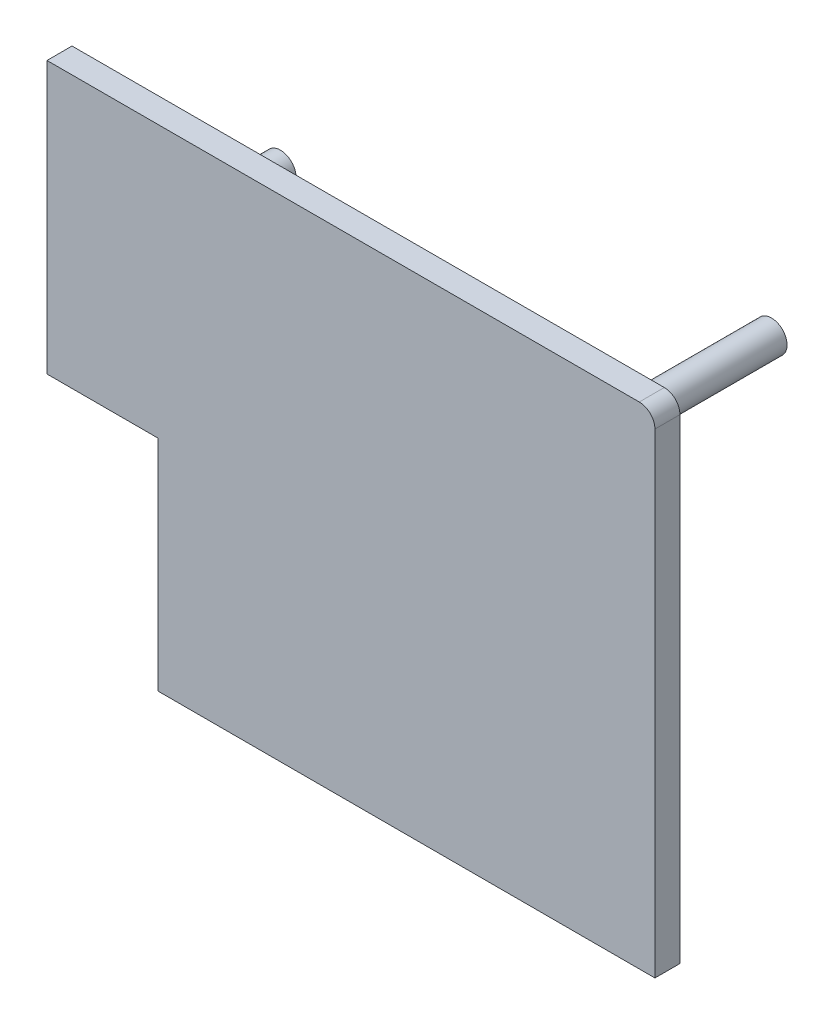
ISO-10303-21;
HEADER;
FILE_DESCRIPTION(('STEP AP214'),'2;1');
FILE_NAME('part.step','',(''),(''),'','','');
FILE_SCHEMA(('AUTOMOTIVE_DESIGN { 1 0 10303 214 1 1 1 1 }'));
ENDSEC;
DATA;
#1=APPLICATION_CONTEXT('core data for automotive mechanical design processes');
#2=APPLICATION_PROTOCOL_DEFINITION('international standard','automotive_design',2000,#1);
#3=PRODUCT_CONTEXT('',#1,'mechanical');
#4=PRODUCT('Part','Part','',(#3));
#5=PRODUCT_RELATED_PRODUCT_CATEGORY('part','',(#4));
#6=PRODUCT_DEFINITION_FORMATION('','',#4);
#7=PRODUCT_DEFINITION_CONTEXT('part definition',#1,'design');
#8=PRODUCT_DEFINITION('design','',#6,#7);
#9=PRODUCT_DEFINITION_SHAPE('','',#8);
#10=(LENGTH_UNIT() NAMED_UNIT(*) SI_UNIT(.MILLI.,.METRE.));
#11=(NAMED_UNIT(*) PLANE_ANGLE_UNIT() SI_UNIT($,.RADIAN.));
#12=(NAMED_UNIT(*) SI_UNIT($,.STERADIAN.) SOLID_ANGLE_UNIT());
#13=UNCERTAINTY_MEASURE_WITH_UNIT(LENGTH_MEASURE(1.E-05),#10,'distance_accuracy_value','');
#14=(GEOMETRIC_REPRESENTATION_CONTEXT(3) GLOBAL_UNCERTAINTY_ASSIGNED_CONTEXT((#13)) GLOBAL_UNIT_ASSIGNED_CONTEXT((#10,
#11,#12)) REPRESENTATION_CONTEXT('',''));
#15=CARTESIAN_POINT('',(0.,0.,0.));
#16=DIRECTION('',(0.,0.,1.));
#17=DIRECTION('',(1.,0.,0.));
#18=AXIS2_PLACEMENT_3D('',#15,#16,#17);
#19=CARTESIAN_POINT('',(214.083314685516,-91.4262053852729,1.6));
#20=DIRECTION('',(0.000641231266330713,-0.999999794411211,0.));
#21=DIRECTION('',(0.99999979441121,0.000641231266330713,0.));
#22=AXIS2_PLACEMENT_3D('',#19,#20,#21);
#23=PLANE('',#22);
#24=DIRECTION('',(-0.99999979441121,-0.000641231266330713,0.));
#25=VECTOR('',#24,1.);
#26=CARTESIAN_POINT('',(214.083314685516,-91.4262053852729,0.));
#27=LINE('',#26,#25);
#28=CARTESIAN_POINT('',(251.949358862533,-91.4019244888224,0.));
#29=VERTEX_POINT('',#28);
#30=CARTESIAN_POINT('',(214.083314685516,-91.4262053852729,0.));
#31=VERTEX_POINT('',#30);
#32=EDGE_CURVE('E130',#29,#31,#27,.T.);
#33=ORIENTED_EDGE('',*,*,#32,.T.);
#34=DIRECTION('',(0.,0.,-1.));
#35=VECTOR('',#34,1.);
#36=CARTESIAN_POINT('',(214.083314685516,-91.4262053852729,1.6));
#37=LINE('',#36,#35);
#38=CARTESIAN_POINT('',(214.083314685516,-91.4262053852729,1.6));
#39=VERTEX_POINT('',#38);
#40=EDGE_CURVE('E11',#39,#31,#37,.T.);
#41=ORIENTED_EDGE('',*,*,#40,.F.);
#42=DIRECTION('',(-0.99999979441121,-0.000641231266330713,0.));
#43=VECTOR('',#42,1.);
#44=CARTESIAN_POINT('',(214.083314685516,-91.4262053852729,1.6));
#45=LINE('',#44,#43);
#46=CARTESIAN_POINT('',(251.949358862533,-91.4019244888224,1.6));
#47=VERTEX_POINT('',#46);
#48=EDGE_CURVE('E143',#47,#39,#45,.T.);
#49=ORIENTED_EDGE('',*,*,#48,.F.);
#50=DIRECTION('',(0.,0.,-1.));
#51=VECTOR('',#50,1.);
#52=CARTESIAN_POINT('',(251.949358862533,-91.4019244888224,1.6));
#53=LINE('',#52,#51);
#54=EDGE_CURVE('E126',#47,#29,#53,.T.);
#55=ORIENTED_EDGE('',*,*,#54,.T.);
#56=EDGE_LOOP('',(#33,#41,#49,#55));
#57=FACE_BOUND('',#56,.T.);
#58=ADVANCED_FACE('F40',(#57),#23,.F.);
#59=CARTESIAN_POINT('',(214.083314685516,-91.4262053852729,1.6));
#60=DIRECTION('',(1.,0.,0.));
#61=DIRECTION('',(0.,0.,-1.));
#62=AXIS2_PLACEMENT_3D('',#59,#60,#61);
#63=PLANE('',#62);
#64=DIRECTION('',(0.,-1.,0.));
#65=VECTOR('',#64,1.);
#66=CARTESIAN_POINT('',(214.083314685516,-91.4262053852729,0.));
#67=LINE('',#66,#65);
#68=CARTESIAN_POINT('',(214.083314685516,-108.787959340399,0.));
#69=VERTEX_POINT('',#68);
#70=EDGE_CURVE('E133',#31,#69,#67,.T.);
#71=ORIENTED_EDGE('',*,*,#70,.T.);
#72=DIRECTION('',(0.,0.,-1.));
#73=VECTOR('',#72,1.);
#74=CARTESIAN_POINT('',(214.083314685516,-108.787959340399,1.6));
#75=LINE('',#74,#73);
#76=CARTESIAN_POINT('',(214.083314685516,-108.787959340399,1.6));
#77=VERTEX_POINT('',#76);
#78=EDGE_CURVE('E48',#77,#69,#75,.T.);
#79=ORIENTED_EDGE('',*,*,#78,.F.);
#80=DIRECTION('',(0.,-1.,0.));
#81=VECTOR('',#80,1.);
#82=CARTESIAN_POINT('',(214.083314685516,-91.4262053852729,1.6));
#83=LINE('',#82,#81);
#84=EDGE_CURVE('E96',#39,#77,#83,.T.);
#85=ORIENTED_EDGE('',*,*,#84,.F.);
#86=ORIENTED_EDGE('',*,*,#40,.T.);
#87=EDGE_LOOP('',(#71,#79,#85,#86));
#88=FACE_BOUND('',#87,.T.);
#89=ADVANCED_FACE('F211',(#88),#63,.F.);
#90=CARTESIAN_POINT('',(214.083314685516,-108.787959340399,1.6));
#91=DIRECTION('',(0.,1.,0.));
#92=DIRECTION('',(0.,0.,1.));
#93=AXIS2_PLACEMENT_3D('',#90,#91,#92);
#94=PLANE('',#93);
#95=DIRECTION('',(1.,0.,0.));
#96=VECTOR('',#95,1.);
#97=CARTESIAN_POINT('',(214.083314685516,-108.787959340399,0.));
#98=LINE('',#97,#96);
#99=CARTESIAN_POINT('',(221.166748687381,-108.787959340399,0.));
#100=VERTEX_POINT('',#99);
#101=EDGE_CURVE('E136',#69,#100,#98,.T.);
#102=ORIENTED_EDGE('',*,*,#101,.T.);
#103=DIRECTION('',(0.,0.,-1.));
#104=VECTOR('',#103,1.);
#105=CARTESIAN_POINT('',(221.166748687381,-108.787959340399,1.6));
#106=LINE('',#105,#104);
#107=CARTESIAN_POINT('',(221.166748687381,-108.787959340399,1.6));
#108=VERTEX_POINT('',#107);
#109=EDGE_CURVE('E147',#108,#100,#106,.T.);
#110=ORIENTED_EDGE('',*,*,#109,.F.);
#111=DIRECTION('',(1.,0.,0.));
#112=VECTOR('',#111,1.);
#113=CARTESIAN_POINT('',(214.083314685516,-108.787959340399,1.6));
#114=LINE('',#113,#112);
#115=EDGE_CURVE('E155',#77,#108,#114,.T.);
#116=ORIENTED_EDGE('',*,*,#115,.F.);
#117=ORIENTED_EDGE('',*,*,#78,.T.);
#118=EDGE_LOOP('',(#102,#110,#116,#117));
#119=FACE_BOUND('',#118,.T.);
#120=ADVANCED_FACE('F153',(#119),#94,.F.);
#121=CARTESIAN_POINT('',(221.166748687381,-108.787959340399,1.6));
#122=DIRECTION('',(1.,0.,0.));
#123=DIRECTION('',(0.,0.,-1.));
#124=AXIS2_PLACEMENT_3D('',#121,#122,#123);
#125=PLANE('',#124);
#126=DIRECTION('',(0.,-1.,0.));
#127=VECTOR('',#126,1.);
#128=CARTESIAN_POINT('',(221.166748687381,-108.787959340399,0.));
#129=LINE('',#128,#127);
#130=CARTESIAN_POINT('',(221.166748687381,-122.793871773047,0.));
#131=VERTEX_POINT('',#130);
#132=EDGE_CURVE('E138',#100,#131,#129,.T.);
#133=ORIENTED_EDGE('',*,*,#132,.T.);
#134=DIRECTION('',(0.,0.,-1.));
#135=VECTOR('',#134,1.);
#136=CARTESIAN_POINT('',(221.166748687381,-122.793871773047,1.6));
#137=LINE('',#136,#135);
#138=CARTESIAN_POINT('',(221.166748687381,-122.793871773047,1.6));
#139=VERTEX_POINT('',#138);
#140=EDGE_CURVE('E121',#139,#131,#137,.T.);
#141=ORIENTED_EDGE('',*,*,#140,.F.);
#142=DIRECTION('',(0.,-1.,0.));
#143=VECTOR('',#142,1.);
#144=CARTESIAN_POINT('',(221.166748687381,-108.787959340399,1.6));
#145=LINE('',#144,#143);
#146=EDGE_CURVE('E112',#108,#139,#145,.T.);
#147=ORIENTED_EDGE('',*,*,#146,.F.);
#148=ORIENTED_EDGE('',*,*,#109,.T.);
#149=EDGE_LOOP('',(#133,#141,#147,#148));
#150=FACE_BOUND('',#149,.T.);
#151=ADVANCED_FACE('F161',(#150),#125,.F.);
#152=CARTESIAN_POINT('',(221.166748687381,-122.793871773047,1.6));
#153=DIRECTION('',(0.,1.,0.));
#154=DIRECTION('',(0.,0.,1.));
#155=AXIS2_PLACEMENT_3D('',#152,#153,#154);
#156=PLANE('',#155);
#157=DIRECTION('',(1.,0.,0.));
#158=VECTOR('',#157,1.);
#159=CARTESIAN_POINT('',(221.166748687381,-122.793871773047,0.));
#160=LINE('',#159,#158);
#161=CARTESIAN_POINT('',(252.95,-122.793871773047,0.));
#162=VERTEX_POINT('',#161);
#163=EDGE_CURVE('E120',#131,#162,#160,.T.);
#164=ORIENTED_EDGE('',*,*,#163,.T.);
#165=DIRECTION('',(0.,0.,-1.));
#166=VECTOR('',#165,1.);
#167=CARTESIAN_POINT('',(252.95,-122.793871773047,1.6));
#168=LINE('',#167,#166);
#169=CARTESIAN_POINT('',(252.95,-122.793871773047,1.6));
#170=VERTEX_POINT('',#169);
#171=EDGE_CURVE('E117',#170,#162,#168,.T.);
#172=ORIENTED_EDGE('',*,*,#171,.F.);
#173=DIRECTION('',(1.,0.,0.));
#174=VECTOR('',#173,1.);
#175=CARTESIAN_POINT('',(221.166748687381,-122.793871773047,1.6));
#176=LINE('',#175,#174);
#177=EDGE_CURVE('E106',#139,#170,#176,.T.);
#178=ORIENTED_EDGE('',*,*,#177,.F.);
#179=ORIENTED_EDGE('',*,*,#140,.T.);
#180=EDGE_LOOP('',(#164,#172,#178,#179));
#181=FACE_BOUND('',#180,.T.);
#182=ADVANCED_FACE('F118',(#181),#156,.F.);
#183=CARTESIAN_POINT('',(252.95,-92.4019243,1.6));
#184=DIRECTION('',(-1.,0.,0.));
#185=DIRECTION('',(0.,0.,1.));
#186=AXIS2_PLACEMENT_3D('',#183,#184,#185);
#187=PLANE('',#186);
#188=DIRECTION('',(0.,1.,0.));
#189=VECTOR('',#188,1.);
#190=CARTESIAN_POINT('',(252.95,-92.4019243,0.));
#191=LINE('',#190,#189);
#192=CARTESIAN_POINT('',(252.95,-92.4019243,0.));
#193=VERTEX_POINT('',#192);
#194=EDGE_CURVE('E82',#162,#193,#191,.T.);
#195=ORIENTED_EDGE('',*,*,#194,.T.);
#196=DIRECTION('',(0.,0.,-1.));
#197=VECTOR('',#196,1.);
#198=CARTESIAN_POINT('',(252.95,-92.4019243,1.6));
#199=LINE('',#198,#197);
#200=CARTESIAN_POINT('',(252.95,-92.4019243,1.6));
#201=VERTEX_POINT('',#200);
#202=EDGE_CURVE('E122',#201,#193,#199,.T.);
#203=ORIENTED_EDGE('',*,*,#202,.F.);
#204=DIRECTION('',(0.,1.,0.));
#205=VECTOR('',#204,1.);
#206=CARTESIAN_POINT('',(252.95,-92.4019243,1.6));
#207=LINE('',#206,#205);
#208=EDGE_CURVE('E110',#170,#201,#207,.T.);
#209=ORIENTED_EDGE('',*,*,#208,.F.);
#210=ORIENTED_EDGE('',*,*,#171,.T.);
#211=EDGE_LOOP('',(#195,#203,#209,#210));
#212=FACE_BOUND('',#211,.T.);
#213=ADVANCED_FACE('F124',(#212),#187,.F.);
#214=CARTESIAN_POINT('',(251.950000093739,-92.4019241894947,1.6));
#215=DIRECTION('',(0.,0.,-1.));
#216=DIRECTION('',(-1.,0.,0.));
#217=AXIS2_PLACEMENT_3D('',#214,#215,#216);
#218=CYLINDRICAL_SURFACE('',#217,0.999999906261072);
#219=CARTESIAN_POINT('',(251.950000093739,-92.4019241894947,0.));
#220=DIRECTION('',(0.,0.,1.));
#221=DIRECTION('',(-1.,0.,0.));
#222=AXIS2_PLACEMENT_3D('',#219,#220,#221);
#223=CIRCLE('',#222,0.999999906261072);
#224=EDGE_CURVE('E88',#193,#29,#223,.T.);
#225=ORIENTED_EDGE('',*,*,#224,.T.);
#226=ORIENTED_EDGE('',*,*,#54,.F.);
#227=CARTESIAN_POINT('',(251.950000093739,-92.4019241894947,1.6));
#228=DIRECTION('',(0.,0.,1.));
#229=DIRECTION('',(-1.,0.,0.));
#230=AXIS2_PLACEMENT_3D('',#227,#228,#229);
#231=CIRCLE('',#230,0.999999906261072);
#232=EDGE_CURVE('E56',#201,#47,#231,.T.);
#233=ORIENTED_EDGE('',*,*,#232,.F.);
#234=ORIENTED_EDGE('',*,*,#202,.T.);
#235=EDGE_LOOP('',(#225,#226,#233,#234));
#236=FACE_BOUND('',#235,.T.);
#237=ADVANCED_FACE('F218',(#236),#218,.T.);
#238=CARTESIAN_POINT('',(251.950000093739,-92.4019241894947,1.6));
#239=DIRECTION('',(0.,0.,-1.));
#240=DIRECTION('',(-1.,0.,0.));
#241=AXIS2_PLACEMENT_3D('',#238,#239,#240);
#242=PLANE('',#241);
#243=ORIENTED_EDGE('',*,*,#48,.T.);
#244=ORIENTED_EDGE('',*,*,#84,.T.);
#245=ORIENTED_EDGE('',*,*,#115,.T.);
#246=ORIENTED_EDGE('',*,*,#146,.T.);
#247=ORIENTED_EDGE('',*,*,#177,.T.);
#248=ORIENTED_EDGE('',*,*,#208,.T.);
#249=ORIENTED_EDGE('',*,*,#232,.T.);
#250=EDGE_LOOP('',(#243,#244,#245,#246,#247,#248,#249));
#251=FACE_BOUND('',#250,.T.);
#252=ADVANCED_FACE('F108',(#251),#242,.F.);
#253=CARTESIAN_POINT('',(251.950000093739,-92.4019241894947,0.));
#254=DIRECTION('',(0.,0.,-1.));
#255=DIRECTION('',(-1.,0.,0.));
#256=AXIS2_PLACEMENT_3D('',#253,#254,#255);
#257=PLANE('',#256);
#258=CARTESIAN_POINT('',(249.796682579057,-94.1240989966427,0.));
#259=DIRECTION('',(0.,0.,-1.));
#260=DIRECTION('',(-1.,0.,0.));
#261=AXIS2_PLACEMENT_3D('',#258,#259,#260);
#262=CIRCLE('',#261,0.999999999999998);
#263=CARTESIAN_POINT('',(248.796682579057,-94.1240989966427,0.));
#264=VERTEX_POINT('',#263);
#265=EDGE_CURVE('E175',#264,#264,#262,.T.);
#266=ORIENTED_EDGE('',*,*,#265,.F.);
#267=EDGE_LOOP('',(#266));
#268=FACE_BOUND('',#267,.T.);
#269=CARTESIAN_POINT('',(241.552042549363,-120.532057670433,0.));
#270=DIRECTION('',(0.,0.,-1.));
#271=DIRECTION('',(-1.,0.,0.));
#272=AXIS2_PLACEMENT_3D('',#269,#270,#271);
#273=CIRCLE('',#272,0.999999999999998);
#274=CARTESIAN_POINT('',(240.552042549363,-120.532057670433,0.));
#275=VERTEX_POINT('',#274);
#276=EDGE_CURVE('E181',#275,#275,#273,.T.);
#277=ORIENTED_EDGE('',*,*,#276,.F.);
#278=EDGE_LOOP('',(#277));
#279=FACE_BOUND('',#278,.T.);
#280=CARTESIAN_POINT('',(218.408459115756,-100.527296583156,0.));
#281=DIRECTION('',(0.,0.,-1.));
#282=DIRECTION('',(-1.,0.,0.));
#283=AXIS2_PLACEMENT_3D('',#280,#281,#282);
#284=CIRCLE('',#283,0.999999999999998);
#285=CARTESIAN_POINT('',(217.408459115756,-100.527296583156,0.));
#286=VERTEX_POINT('',#285);
#287=EDGE_CURVE('E169',#286,#286,#284,.T.);
#288=ORIENTED_EDGE('',*,*,#287,.F.);
#289=EDGE_LOOP('',(#288));
#290=FACE_BOUND('',#289,.T.);
#291=CARTESIAN_POINT('',(224.853507666887,-120.532057670433,0.));
#292=DIRECTION('',(0.,0.,-1.));
#293=DIRECTION('',(-1.,0.,0.));
#294=AXIS2_PLACEMENT_3D('',#291,#292,#293);
#295=CIRCLE('',#294,0.999999999999998);
#296=CARTESIAN_POINT('',(223.853507666887,-120.532057670433,0.));
#297=VERTEX_POINT('',#296);
#298=EDGE_CURVE('E166',#297,#297,#295,.T.);
#299=ORIENTED_EDGE('',*,*,#298,.F.);
#300=EDGE_LOOP('',(#299));
#301=FACE_BOUND('',#300,.T.);
#302=ORIENTED_EDGE('',*,*,#32,.F.);
#303=ORIENTED_EDGE('',*,*,#224,.F.);
#304=ORIENTED_EDGE('',*,*,#194,.F.);
#305=ORIENTED_EDGE('',*,*,#163,.F.);
#306=ORIENTED_EDGE('',*,*,#132,.F.);
#307=ORIENTED_EDGE('',*,*,#101,.F.);
#308=ORIENTED_EDGE('',*,*,#70,.F.);
#309=EDGE_LOOP('',(#302,#303,#304,#305,#306,#307,#308));
#310=FACE_BOUND('',#309,.T.);
#311=ADVANCED_FACE('F159',(#268,#279,#290,#301,#310),#257,.T.);
#312=CARTESIAN_POINT('',(224.853507666887,-120.532057670433,-9.));
#313=DIRECTION('',(0.,0.,1.));
#314=DIRECTION('',(1.,0.,0.));
#315=AXIS2_PLACEMENT_3D('',#312,#313,#314);
#316=CYLINDRICAL_SURFACE('',#315,0.999999999999998);
#317=CARTESIAN_POINT('',(224.853507666887,-120.532057670433,-9.));
#318=DIRECTION('',(0.,0.,-1.));
#319=DIRECTION('',(-1.,0.,0.));
#320=AXIS2_PLACEMENT_3D('',#317,#318,#319);
#321=CIRCLE('',#320,0.999999999999998);
#322=CARTESIAN_POINT('',(223.853507666887,-120.532057670433,-9.));
#323=VERTEX_POINT('',#322);
#324=EDGE_CURVE('E134',#323,#323,#321,.T.);
#325=ORIENTED_EDGE('',*,*,#324,.F.);
#326=EDGE_LOOP('',(#325));
#327=FACE_BOUND('',#326,.T.);
#328=ORIENTED_EDGE('',*,*,#298,.T.);
#329=EDGE_LOOP('',(#328));
#330=FACE_BOUND('',#329,.T.);
#331=ADVANCED_FACE('F194',(#327,#330),#316,.T.);
#332=CARTESIAN_POINT('',(224.853507666887,-120.532057670433,-9.));
#333=DIRECTION('',(0.,0.,-1.));
#334=DIRECTION('',(-1.,0.,0.));
#335=AXIS2_PLACEMENT_3D('',#332,#333,#334);
#336=PLANE('',#335);
#337=ORIENTED_EDGE('',*,*,#324,.T.);
#338=EDGE_LOOP('',(#337));
#339=FACE_BOUND('',#338,.T.);
#340=ADVANCED_FACE('F200',(#339),#336,.T.);
#341=CARTESIAN_POINT('',(218.408459115756,-100.527296583156,-9.));
#342=DIRECTION('',(0.,0.,1.));
#343=DIRECTION('',(1.,0.,0.));
#344=AXIS2_PLACEMENT_3D('',#341,#342,#343);
#345=CYLINDRICAL_SURFACE('',#344,0.999999999999998);
#346=CARTESIAN_POINT('',(218.408459115756,-100.527296583156,-9.));
#347=DIRECTION('',(0.,0.,-1.));
#348=DIRECTION('',(-1.,0.,0.));
#349=AXIS2_PLACEMENT_3D('',#346,#347,#348);
#350=CIRCLE('',#349,0.999999999999998);
#351=CARTESIAN_POINT('',(217.408459115756,-100.527296583156,-9.));
#352=VERTEX_POINT('',#351);
#353=EDGE_CURVE('E184',#352,#352,#350,.T.);
#354=ORIENTED_EDGE('',*,*,#353,.F.);
#355=EDGE_LOOP('',(#354));
#356=FACE_BOUND('',#355,.T.);
#357=ORIENTED_EDGE('',*,*,#287,.T.);
#358=EDGE_LOOP('',(#357));
#359=FACE_BOUND('',#358,.T.);
#360=ADVANCED_FACE('F190',(#356,#359),#345,.T.);
#361=CARTESIAN_POINT('',(218.408459115756,-100.527296583156,-9.));
#362=DIRECTION('',(0.,0.,-1.));
#363=DIRECTION('',(-1.,0.,0.));
#364=AXIS2_PLACEMENT_3D('',#361,#362,#363);
#365=PLANE('',#364);
#366=ORIENTED_EDGE('',*,*,#353,.T.);
#367=EDGE_LOOP('',(#366));
#368=FACE_BOUND('',#367,.T.);
#369=ADVANCED_FACE('F287',(#368),#365,.T.);
#370=CARTESIAN_POINT('',(241.552042549363,-120.532057670433,-9.));
#371=DIRECTION('',(0.,0.,1.));
#372=DIRECTION('',(1.,0.,0.));
#373=AXIS2_PLACEMENT_3D('',#370,#371,#372);
#374=CYLINDRICAL_SURFACE('',#373,0.999999999999998);
#375=CARTESIAN_POINT('',(241.552042549363,-120.532057670433,-9.));
#376=DIRECTION('',(0.,0.,-1.));
#377=DIRECTION('',(-1.,0.,0.));
#378=AXIS2_PLACEMENT_3D('',#375,#376,#377);
#379=CIRCLE('',#378,0.999999999999998);
#380=CARTESIAN_POINT('',(240.552042549363,-120.532057670433,-9.));
#381=VERTEX_POINT('',#380);
#382=EDGE_CURVE('E178',#381,#381,#379,.T.);
#383=ORIENTED_EDGE('',*,*,#382,.F.);
#384=EDGE_LOOP('',(#383));
#385=FACE_BOUND('',#384,.T.);
#386=ORIENTED_EDGE('',*,*,#276,.T.);
#387=EDGE_LOOP('',(#386));
#388=FACE_BOUND('',#387,.T.);
#389=ADVANCED_FACE('F297',(#385,#388),#374,.T.);
#390=CARTESIAN_POINT('',(241.552042549363,-120.532057670433,-9.));
#391=DIRECTION('',(0.,0.,-1.));
#392=DIRECTION('',(-1.,0.,0.));
#393=AXIS2_PLACEMENT_3D('',#390,#391,#392);
#394=PLANE('',#393);
#395=ORIENTED_EDGE('',*,*,#382,.T.);
#396=EDGE_LOOP('',(#395));
#397=FACE_BOUND('',#396,.T.);
#398=ADVANCED_FACE('F307',(#397),#394,.T.);
#399=CARTESIAN_POINT('',(249.796682579057,-94.1240989966427,-9.));
#400=DIRECTION('',(0.,0.,1.));
#401=DIRECTION('',(1.,0.,0.));
#402=AXIS2_PLACEMENT_3D('',#399,#400,#401);
#403=CYLINDRICAL_SURFACE('',#402,0.999999999999998);
#404=CARTESIAN_POINT('',(249.796682579057,-94.1240989966427,-9.));
#405=DIRECTION('',(0.,0.,-1.));
#406=DIRECTION('',(-1.,0.,0.));
#407=AXIS2_PLACEMENT_3D('',#404,#405,#406);
#408=CIRCLE('',#407,0.999999999999998);
#409=CARTESIAN_POINT('',(248.796682579057,-94.1240989966427,-9.));
#410=VERTEX_POINT('',#409);
#411=EDGE_CURVE('E172',#410,#410,#408,.T.);
#412=ORIENTED_EDGE('',*,*,#411,.F.);
#413=EDGE_LOOP('',(#412));
#414=FACE_BOUND('',#413,.T.);
#415=ORIENTED_EDGE('',*,*,#265,.T.);
#416=EDGE_LOOP('',(#415));
#417=FACE_BOUND('',#416,.T.);
#418=ADVANCED_FACE('F317',(#414,#417),#403,.T.);
#419=CARTESIAN_POINT('',(249.796682579057,-94.1240989966427,-9.));
#420=DIRECTION('',(0.,0.,-1.));
#421=DIRECTION('',(-1.,0.,0.));
#422=AXIS2_PLACEMENT_3D('',#419,#420,#421);
#423=PLANE('',#422);
#424=ORIENTED_EDGE('',*,*,#411,.T.);
#425=EDGE_LOOP('',(#424));
#426=FACE_BOUND('',#425,.T.);
#427=ADVANCED_FACE('F327',(#426),#423,.T.);
#428=CLOSED_SHELL('',(#58,#89,#120,#151,#182,#213,#237,#252,#311,#331,#340,#360,#369,#389,#398,
#418,#427));
#429=MANIFOLD_SOLID_BREP('B2',#428);
#430=ADVANCED_BREP_SHAPE_REPRESENTATION('',(#18,#429),#14);
#431=SHAPE_DEFINITION_REPRESENTATION(#9,#430);
ENDSEC;
END-ISO-10303-21;
